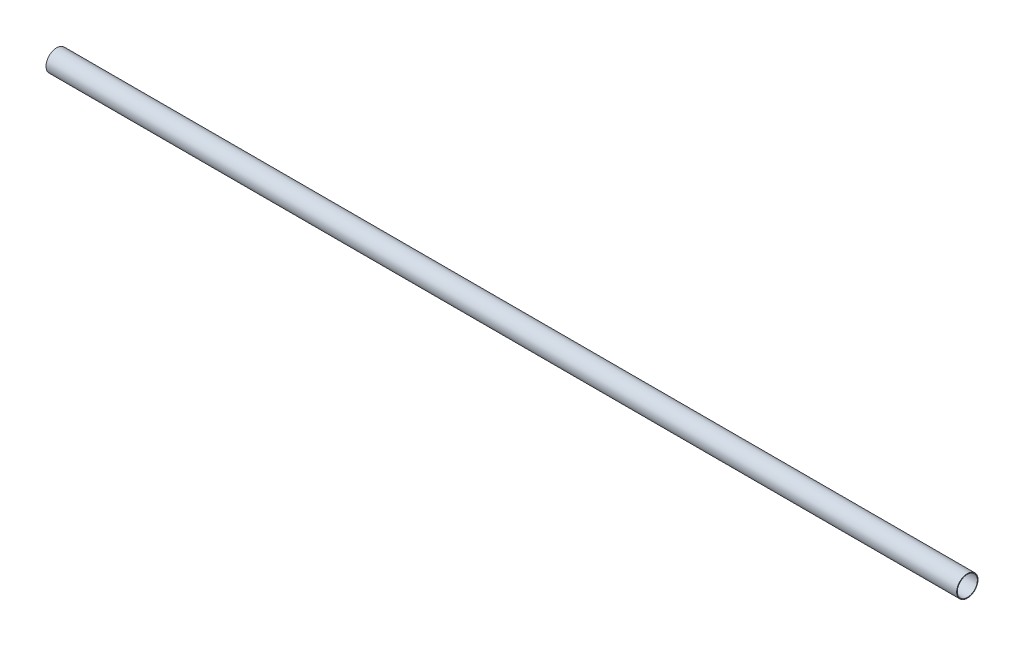
ISO-10303-21;
HEADER;
FILE_DESCRIPTION(('STEP AP214'),'2;1');
FILE_NAME('part.step','',(''),(''),'','','');
FILE_SCHEMA(('AUTOMOTIVE_DESIGN { 1 0 10303 214 1 1 1 1 }'));
ENDSEC;
DATA;
#1=APPLICATION_CONTEXT('core data for automotive mechanical design processes');
#2=APPLICATION_PROTOCOL_DEFINITION('international standard','automotive_design',2000,#1);
#3=PRODUCT_CONTEXT('',#1,'mechanical');
#4=PRODUCT('Part','Part','',(#3));
#5=PRODUCT_RELATED_PRODUCT_CATEGORY('part','',(#4));
#6=PRODUCT_DEFINITION_FORMATION('','',#4);
#7=PRODUCT_DEFINITION_CONTEXT('part definition',#1,'design');
#8=PRODUCT_DEFINITION('design','',#6,#7);
#9=PRODUCT_DEFINITION_SHAPE('','',#8);
#10=(LENGTH_UNIT() NAMED_UNIT(*) SI_UNIT(.MILLI.,.METRE.));
#11=(NAMED_UNIT(*) PLANE_ANGLE_UNIT() SI_UNIT($,.RADIAN.));
#12=(NAMED_UNIT(*) SI_UNIT($,.STERADIAN.) SOLID_ANGLE_UNIT());
#13=UNCERTAINTY_MEASURE_WITH_UNIT(LENGTH_MEASURE(1.E-05),#10,'distance_accuracy_value','');
#14=(GEOMETRIC_REPRESENTATION_CONTEXT(3) GLOBAL_UNCERTAINTY_ASSIGNED_CONTEXT((#13)) GLOBAL_UNIT_ASSIGNED_CONTEXT((#10,
#11,#12)) REPRESENTATION_CONTEXT('',''));
#15=CARTESIAN_POINT('',(0.,0.,0.));
#16=DIRECTION('',(0.,0.,1.));
#17=DIRECTION('',(1.,0.,0.));
#18=AXIS2_PLACEMENT_3D('',#15,#16,#17);
#19=CARTESIAN_POINT('',(609.6,0.,0.));
#20=DIRECTION('',(1.,0.,0.));
#21=DIRECTION('',(0.,0.,-1.));
#22=AXIS2_PLACEMENT_3D('',#19,#20,#21);
#23=PLANE('',#22);
#24=CARTESIAN_POINT('',(609.6,0.,0.));
#25=DIRECTION('',(1.,0.,0.));
#26=DIRECTION('',(0.,0.,-1.));
#27=AXIS2_PLACEMENT_3D('',#24,#25,#26);
#28=CIRCLE('',#27,14.2875);
#29=CARTESIAN_POINT('',(609.6,0.,14.2875));
#30=VERTEX_POINT('',#29);
#31=EDGE_CURVE('E10',#30,#30,#28,.T.);
#32=ORIENTED_EDGE('',*,*,#31,.T.);
#33=EDGE_LOOP('',(#32));
#34=FACE_BOUND('',#33,.T.);
#35=CARTESIAN_POINT('',(609.6,0.,0.));
#36=DIRECTION('',(1.,0.,0.));
#37=DIRECTION('',(0.,0.,-1.));
#38=AXIS2_PLACEMENT_3D('',#35,#36,#37);
#39=CIRCLE('',#38,13.3985);
#40=CARTESIAN_POINT('',(609.6,0.,13.3985));
#41=VERTEX_POINT('',#40);
#42=EDGE_CURVE('E42',#41,#41,#39,.T.);
#43=ORIENTED_EDGE('',*,*,#42,.F.);
#44=EDGE_LOOP('',(#43));
#45=FACE_BOUND('',#44,.T.);
#46=ADVANCED_FACE('F31',(#34,#45),#23,.T.);
#47=CARTESIAN_POINT('',(-609.6,0.,0.));
#48=DIRECTION('',(1.,0.,0.));
#49=DIRECTION('',(0.,0.,-1.));
#50=AXIS2_PLACEMENT_3D('',#47,#48,#49);
#51=PLANE('',#50);
#52=CARTESIAN_POINT('',(-609.6,0.,0.));
#53=DIRECTION('',(1.,0.,0.));
#54=DIRECTION('',(0.,0.,-1.));
#55=AXIS2_PLACEMENT_3D('',#52,#53,#54);
#56=CIRCLE('',#55,14.2875);
#57=CARTESIAN_POINT('',(-609.6,0.,14.2875));
#58=VERTEX_POINT('',#57);
#59=EDGE_CURVE('E35',#58,#58,#56,.T.);
#60=ORIENTED_EDGE('',*,*,#59,.F.);
#61=EDGE_LOOP('',(#60));
#62=FACE_BOUND('',#61,.T.);
#63=CARTESIAN_POINT('',(-609.6,0.,0.));
#64=DIRECTION('',(1.,0.,0.));
#65=DIRECTION('',(0.,0.,-1.));
#66=AXIS2_PLACEMENT_3D('',#63,#64,#65);
#67=CIRCLE('',#66,13.3985);
#68=CARTESIAN_POINT('',(-609.6,0.,13.3985));
#69=VERTEX_POINT('',#68);
#70=EDGE_CURVE('E44',#69,#69,#67,.T.);
#71=ORIENTED_EDGE('',*,*,#70,.T.);
#72=EDGE_LOOP('',(#71));
#73=FACE_BOUND('',#72,.T.);
#74=ADVANCED_FACE('F54',(#62,#73),#51,.F.);
#75=CARTESIAN_POINT('',(609.6,0.,0.));
#76=DIRECTION('',(-1.,0.,0.));
#77=DIRECTION('',(0.,0.,1.));
#78=AXIS2_PLACEMENT_3D('',#75,#76,#77);
#79=CYLINDRICAL_SURFACE('',#78,14.2875);
#80=CARTESIAN_POINT('',(609.6,0.,14.2875));
#81=CARTESIAN_POINT('',(596.9,0.,14.2875));
#82=CARTESIAN_POINT('',(584.2,0.,14.2875));
#83=CARTESIAN_POINT('',(558.8,0.,14.2875));
#84=CARTESIAN_POINT('',(546.1,0.,14.2875));
#85=CARTESIAN_POINT('',(520.7,0.,14.2875));
#86=CARTESIAN_POINT('',(508.,0.,14.2875));
#87=CARTESIAN_POINT('',(482.6,0.,14.2875));
#88=CARTESIAN_POINT('',(469.9,0.,14.2875));
#89=CARTESIAN_POINT('',(444.5,0.,14.2875));
#90=CARTESIAN_POINT('',(431.8,0.,14.2875));
#91=CARTESIAN_POINT('',(406.4,0.,14.2875));
#92=CARTESIAN_POINT('',(393.7,0.,14.2875));
#93=CARTESIAN_POINT('',(368.3,0.,14.2875));
#94=CARTESIAN_POINT('',(355.6,0.,14.2875));
#95=CARTESIAN_POINT('',(330.2,0.,14.2875));
#96=CARTESIAN_POINT('',(317.5,0.,14.2875));
#97=CARTESIAN_POINT('',(292.1,0.,14.2875));
#98=CARTESIAN_POINT('',(279.4,0.,14.2875));
#99=CARTESIAN_POINT('',(254.,0.,14.2875));
#100=CARTESIAN_POINT('',(241.3,0.,14.2875));
#101=CARTESIAN_POINT('',(215.9,0.,14.2875));
#102=CARTESIAN_POINT('',(203.2,0.,14.2875));
#103=CARTESIAN_POINT('',(177.8,0.,14.2875));
#104=CARTESIAN_POINT('',(165.1,0.,14.2875));
#105=CARTESIAN_POINT('',(139.7,0.,14.2875));
#106=CARTESIAN_POINT('',(127.,0.,14.2875));
#107=CARTESIAN_POINT('',(101.6,0.,14.2875));
#108=CARTESIAN_POINT('',(88.8999999999999,0.,14.2875));
#109=CARTESIAN_POINT('',(63.4999999999999,0.,14.2875));
#110=CARTESIAN_POINT('',(50.7999999999999,0.,14.2875));
#111=CARTESIAN_POINT('',(25.3999999999999,0.,14.2875));
#112=CARTESIAN_POINT('',(12.6999999999999,0.,14.2875));
#113=CARTESIAN_POINT('',(-12.7000000000001,0.,14.2875));
#114=CARTESIAN_POINT('',(-25.4000000000001,0.,14.2875));
#115=CARTESIAN_POINT('',(-50.8000000000001,0.,14.2875));
#116=CARTESIAN_POINT('',(-63.5000000000002,0.,14.2875));
#117=CARTESIAN_POINT('',(-88.9000000000002,0.,14.2875));
#118=CARTESIAN_POINT('',(-101.6,0.,14.2875));
#119=CARTESIAN_POINT('',(-127.,0.,14.2875));
#120=CARTESIAN_POINT('',(-139.7,0.,14.2875));
#121=CARTESIAN_POINT('',(-165.1,0.,14.2875));
#122=CARTESIAN_POINT('',(-177.8,0.,14.2875));
#123=CARTESIAN_POINT('',(-203.2,0.,14.2875));
#124=CARTESIAN_POINT('',(-215.9,0.,14.2875));
#125=CARTESIAN_POINT('',(-241.3,0.,14.2875));
#126=CARTESIAN_POINT('',(-254.,0.,14.2875));
#127=CARTESIAN_POINT('',(-279.4,0.,14.2875));
#128=CARTESIAN_POINT('',(-292.1,0.,14.2875));
#129=CARTESIAN_POINT('',(-317.5,0.,14.2875));
#130=CARTESIAN_POINT('',(-330.2,0.,14.2875));
#131=CARTESIAN_POINT('',(-355.6,0.,14.2875));
#132=CARTESIAN_POINT('',(-368.3,0.,14.2875));
#133=CARTESIAN_POINT('',(-393.7,0.,14.2875));
#134=CARTESIAN_POINT('',(-406.4,0.,14.2875));
#135=CARTESIAN_POINT('',(-431.8,0.,14.2875));
#136=CARTESIAN_POINT('',(-444.5,0.,14.2875));
#137=CARTESIAN_POINT('',(-469.9,0.,14.2875));
#138=CARTESIAN_POINT('',(-482.6,0.,14.2875));
#139=CARTESIAN_POINT('',(-508.,0.,14.2875));
#140=CARTESIAN_POINT('',(-520.7,0.,14.2875));
#141=CARTESIAN_POINT('',(-546.1,0.,14.2875));
#142=CARTESIAN_POINT('',(-558.8,0.,14.2875));
#143=CARTESIAN_POINT('',(-584.2,0.,14.2875));
#144=CARTESIAN_POINT('',(-596.9,0.,14.2875));
#145=CARTESIAN_POINT('',(-609.6,0.,14.2875));
#146=B_SPLINE_CURVE_WITH_KNOTS('',3,(#80,#81,#82,#83,#84,#85,#86,#87,#88,#89,#90,#91,#92,#93,
#94,#95,#96,#97,#98,#99,#100,#101,#102,#103,#104,#105,#106,#107,#108,#109,#110,#111,#112,#113,
#114,#115,#116,#117,#118,#119,#120,#121,#122,#123,#124,#125,#126,#127,#128,#129,#130,#131,#132,
#133,#134,#135,#136,#137,#138,#139,#140,#141,#142,#143,#144,#145),.UNSPECIFIED.,.F.,.F.,(4,2,2,
2,2,2,2,2,2,2,2,2,2,2,2,2,2,2,2,2,2,2,2,2,2,2,2,2,2,2,2,2,4),(0.,38.0999999999999,
76.1999999999999,114.3,152.4,190.5,228.6,266.7,304.8,342.9,381.,419.1,457.2,495.3,533.4,571.5,
609.6,647.7,685.8,723.9,762.,800.1,838.2,876.3,914.4,952.5,990.6,1028.7,1066.8,1104.9,1143.,
1181.1,1219.2),.UNSPECIFIED.);
#147=EDGE_CURVE('BSEAM33',#30,#58,#146,.T.);
#148=ORIENTED_EDGE('',*,*,#31,.F.);
#149=ORIENTED_EDGE('',*,*,#59,.T.);
#150=ORIENTED_EDGE('',*,*,#147,.T.);
#151=ORIENTED_EDGE('',*,*,#147,.F.);
#152=EDGE_LOOP('',(#148,#150,#149,#151));
#153=FACE_BOUND('',#152,.T.);
#154=ADVANCED_FACE('F33',(#153),#79,.T.);
#155=CARTESIAN_POINT('',(609.6,0.,0.));
#156=DIRECTION('',(-1.,0.,0.));
#157=DIRECTION('',(0.,0.,1.));
#158=AXIS2_PLACEMENT_3D('',#155,#156,#157);
#159=CYLINDRICAL_SURFACE('',#158,13.3985);
#160=CARTESIAN_POINT('',(609.6,0.,13.3985));
#161=CARTESIAN_POINT('',(596.9,0.,13.3985));
#162=CARTESIAN_POINT('',(584.2,0.,13.3985));
#163=CARTESIAN_POINT('',(558.8,0.,13.3985));
#164=CARTESIAN_POINT('',(546.1,0.,13.3985));
#165=CARTESIAN_POINT('',(520.7,0.,13.3985));
#166=CARTESIAN_POINT('',(508.,0.,13.3985));
#167=CARTESIAN_POINT('',(482.6,0.,13.3985));
#168=CARTESIAN_POINT('',(469.9,0.,13.3985));
#169=CARTESIAN_POINT('',(444.5,0.,13.3985));
#170=CARTESIAN_POINT('',(431.8,0.,13.3985));
#171=CARTESIAN_POINT('',(406.4,0.,13.3985));
#172=CARTESIAN_POINT('',(393.7,0.,13.3985));
#173=CARTESIAN_POINT('',(368.3,0.,13.3985));
#174=CARTESIAN_POINT('',(355.6,0.,13.3985));
#175=CARTESIAN_POINT('',(330.2,0.,13.3985));
#176=CARTESIAN_POINT('',(317.5,0.,13.3985));
#177=CARTESIAN_POINT('',(292.1,0.,13.3985));
#178=CARTESIAN_POINT('',(279.4,0.,13.3985));
#179=CARTESIAN_POINT('',(254.,0.,13.3985));
#180=CARTESIAN_POINT('',(241.3,0.,13.3985));
#181=CARTESIAN_POINT('',(215.9,0.,13.3985));
#182=CARTESIAN_POINT('',(203.2,0.,13.3985));
#183=CARTESIAN_POINT('',(177.8,0.,13.3985));
#184=CARTESIAN_POINT('',(165.1,0.,13.3985));
#185=CARTESIAN_POINT('',(139.7,0.,13.3985));
#186=CARTESIAN_POINT('',(127.,0.,13.3985));
#187=CARTESIAN_POINT('',(101.6,0.,13.3985));
#188=CARTESIAN_POINT('',(88.8999999999999,0.,13.3985));
#189=CARTESIAN_POINT('',(63.4999999999999,0.,13.3985));
#190=CARTESIAN_POINT('',(50.7999999999999,0.,13.3985));
#191=CARTESIAN_POINT('',(25.3999999999999,0.,13.3985));
#192=CARTESIAN_POINT('',(12.6999999999999,0.,13.3985));
#193=CARTESIAN_POINT('',(-12.7000000000001,0.,13.3985));
#194=CARTESIAN_POINT('',(-25.4000000000001,0.,13.3985));
#195=CARTESIAN_POINT('',(-50.8000000000001,0.,13.3985));
#196=CARTESIAN_POINT('',(-63.5000000000002,0.,13.3985));
#197=CARTESIAN_POINT('',(-88.9000000000002,0.,13.3985));
#198=CARTESIAN_POINT('',(-101.6,0.,13.3985));
#199=CARTESIAN_POINT('',(-127.,0.,13.3985));
#200=CARTESIAN_POINT('',(-139.7,0.,13.3985));
#201=CARTESIAN_POINT('',(-165.1,0.,13.3985));
#202=CARTESIAN_POINT('',(-177.8,0.,13.3985));
#203=CARTESIAN_POINT('',(-203.2,0.,13.3985));
#204=CARTESIAN_POINT('',(-215.9,0.,13.3985));
#205=CARTESIAN_POINT('',(-241.3,0.,13.3985));
#206=CARTESIAN_POINT('',(-254.,0.,13.3985));
#207=CARTESIAN_POINT('',(-279.4,0.,13.3985));
#208=CARTESIAN_POINT('',(-292.1,0.,13.3985));
#209=CARTESIAN_POINT('',(-317.5,0.,13.3985));
#210=CARTESIAN_POINT('',(-330.2,0.,13.3985));
#211=CARTESIAN_POINT('',(-355.6,0.,13.3985));
#212=CARTESIAN_POINT('',(-368.3,0.,13.3985));
#213=CARTESIAN_POINT('',(-393.7,0.,13.3985));
#214=CARTESIAN_POINT('',(-406.4,0.,13.3985));
#215=CARTESIAN_POINT('',(-431.8,0.,13.3985));
#216=CARTESIAN_POINT('',(-444.5,0.,13.3985));
#217=CARTESIAN_POINT('',(-469.9,0.,13.3985));
#218=CARTESIAN_POINT('',(-482.6,0.,13.3985));
#219=CARTESIAN_POINT('',(-508.,0.,13.3985));
#220=CARTESIAN_POINT('',(-520.7,0.,13.3985));
#221=CARTESIAN_POINT('',(-546.1,0.,13.3985));
#222=CARTESIAN_POINT('',(-558.8,0.,13.3985));
#223=CARTESIAN_POINT('',(-584.2,0.,13.3985));
#224=CARTESIAN_POINT('',(-596.9,0.,13.3985));
#225=CARTESIAN_POINT('',(-609.6,0.,13.3985));
#226=B_SPLINE_CURVE_WITH_KNOTS('',3,(#160,#161,#162,#163,#164,#165,#166,#167,#168,#169,#170,
#171,#172,#173,#174,#175,#176,#177,#178,#179,#180,#181,#182,#183,#184,#185,#186,#187,#188,#189,
#190,#191,#192,#193,#194,#195,#196,#197,#198,#199,#200,#201,#202,#203,#204,#205,#206,#207,#208,
#209,#210,#211,#212,#213,#214,#215,#216,#217,#218,#219,#220,#221,#222,#223,#224,#225),
.UNSPECIFIED.,.F.,.F.,(4,2,2,2,2,2,2,2,2,2,2,2,2,2,2,2,2,2,2,2,2,2,2,2,2,2,2,2,2,2,2,2,4),(0.,
38.0999999999999,76.1999999999999,114.3,152.4,190.5,228.6,266.7,304.8,342.9,381.,419.1,457.2,
495.3,533.4,571.5,609.6,647.7,685.8,723.9,762.,800.1,838.2,876.3,914.4,952.5,990.6,1028.7,
1066.8,1104.9,1143.,1181.1,1219.2),.UNSPECIFIED.);
#227=EDGE_CURVE('BSEAM50',#41,#69,#226,.T.);
#228=ORIENTED_EDGE('',*,*,#42,.T.);
#229=ORIENTED_EDGE('',*,*,#70,.F.);
#230=ORIENTED_EDGE('',*,*,#227,.T.);
#231=ORIENTED_EDGE('',*,*,#227,.F.);
#232=EDGE_LOOP('',(#228,#230,#229,#231));
#233=FACE_BOUND('',#232,.T.);
#234=ADVANCED_FACE('F50',(#233),#159,.F.);
#235=CLOSED_SHELL('',(#46,#74,#154,#234));
#236=MANIFOLD_SOLID_BREP('B2',#235);
#237=ADVANCED_BREP_SHAPE_REPRESENTATION('',(#18,#236),#14);
#238=SHAPE_DEFINITION_REPRESENTATION(#9,#237);
ENDSEC;
END-ISO-10303-21;
